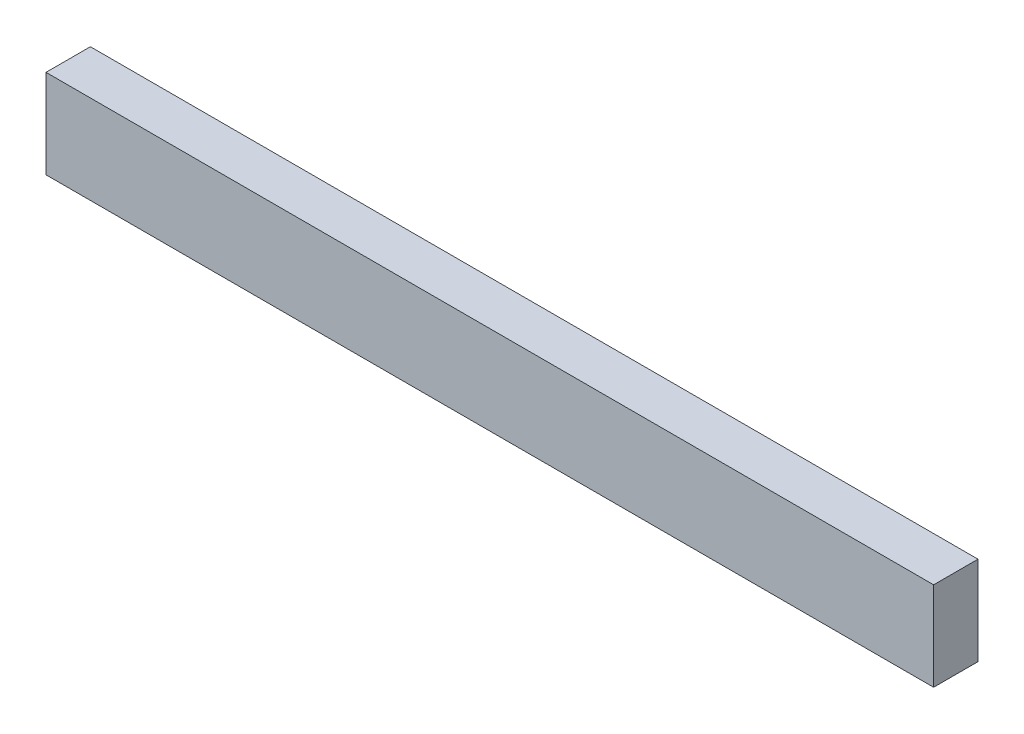
ISO-10303-21;
HEADER;
FILE_DESCRIPTION(('STEP AP214'),'2;1');
FILE_NAME('part.step','',(''),(''),'','','');
FILE_SCHEMA(('AUTOMOTIVE_DESIGN { 1 0 10303 214 1 1 1 1 }'));
ENDSEC;
DATA;
#1=APPLICATION_CONTEXT('core data for automotive mechanical design processes');
#2=APPLICATION_PROTOCOL_DEFINITION('international standard','automotive_design',2000,#1);
#3=PRODUCT_CONTEXT('',#1,'mechanical');
#4=PRODUCT('Part','Part','',(#3));
#5=PRODUCT_RELATED_PRODUCT_CATEGORY('part','',(#4));
#6=PRODUCT_DEFINITION_FORMATION('','',#4);
#7=PRODUCT_DEFINITION_CONTEXT('part definition',#1,'design');
#8=PRODUCT_DEFINITION('design','',#6,#7);
#9=PRODUCT_DEFINITION_SHAPE('','',#8);
#10=(LENGTH_UNIT() NAMED_UNIT(*) SI_UNIT(.MILLI.,.METRE.));
#11=(NAMED_UNIT(*) PLANE_ANGLE_UNIT() SI_UNIT($,.RADIAN.));
#12=(NAMED_UNIT(*) SI_UNIT($,.STERADIAN.) SOLID_ANGLE_UNIT());
#13=UNCERTAINTY_MEASURE_WITH_UNIT(LENGTH_MEASURE(1.E-05),#10,'distance_accuracy_value','');
#14=(GEOMETRIC_REPRESENTATION_CONTEXT(3) GLOBAL_UNCERTAINTY_ASSIGNED_CONTEXT((#13)) GLOBAL_UNIT_ASSIGNED_CONTEXT((#10,
#11,#12)) REPRESENTATION_CONTEXT('',''));
#15=CARTESIAN_POINT('',(0.,0.,0.));
#16=DIRECTION('',(0.,0.,1.));
#17=DIRECTION('',(1.,0.,0.));
#18=AXIS2_PLACEMENT_3D('',#15,#16,#17);
#19=CARTESIAN_POINT('',(10.,-1.,1.));
#20=DIRECTION('',(-1.,0.,0.));
#21=DIRECTION('',(0.,0.,1.));
#22=AXIS2_PLACEMENT_3D('',#19,#20,#21);
#23=PLANE('',#22);
#24=DIRECTION('',(0.,1.,0.));
#25=VECTOR('',#24,1.);
#26=CARTESIAN_POINT('',(10.,-1.,0.));
#27=LINE('',#26,#25);
#28=CARTESIAN_POINT('',(10.,-1.,0.));
#29=VERTEX_POINT('',#28);
#30=CARTESIAN_POINT('',(10.,1.,0.));
#31=VERTEX_POINT('',#30);
#32=EDGE_CURVE('E107',#29,#31,#27,.T.);
#33=ORIENTED_EDGE('',*,*,#32,.T.);
#34=DIRECTION('',(0.,0.,-1.));
#35=VECTOR('',#34,1.);
#36=CARTESIAN_POINT('',(10.,1.,1.));
#37=LINE('',#36,#35);
#38=CARTESIAN_POINT('',(10.,1.,1.));
#39=VERTEX_POINT('',#38);
#40=EDGE_CURVE('E11',#39,#31,#37,.T.);
#41=ORIENTED_EDGE('',*,*,#40,.F.);
#42=DIRECTION('',(0.,1.,0.));
#43=VECTOR('',#42,1.);
#44=CARTESIAN_POINT('',(10.,-1.,1.));
#45=LINE('',#44,#43);
#46=CARTESIAN_POINT('',(10.,-1.,1.));
#47=VERTEX_POINT('',#46);
#48=EDGE_CURVE('E91',#47,#39,#45,.T.);
#49=ORIENTED_EDGE('',*,*,#48,.F.);
#50=DIRECTION('',(0.,0.,-1.));
#51=VECTOR('',#50,1.);
#52=CARTESIAN_POINT('',(10.,-1.,1.));
#53=LINE('',#52,#51);
#54=EDGE_CURVE('E103',#47,#29,#53,.T.);
#55=ORIENTED_EDGE('',*,*,#54,.T.);
#56=EDGE_LOOP('',(#33,#41,#49,#55));
#57=FACE_BOUND('',#56,.T.);
#58=ADVANCED_FACE('F39',(#57),#23,.F.);
#59=CARTESIAN_POINT('',(-10.,1.,1.));
#60=DIRECTION('',(0.,-1.,0.));
#61=DIRECTION('',(0.,0.,-1.));
#62=AXIS2_PLACEMENT_3D('',#59,#60,#61);
#63=PLANE('',#62);
#64=DIRECTION('',(-1.,0.,0.));
#65=VECTOR('',#64,1.);
#66=CARTESIAN_POINT('',(-10.,1.,0.));
#67=LINE('',#66,#65);
#68=CARTESIAN_POINT('',(-10.,1.,0.));
#69=VERTEX_POINT('',#68);
#70=EDGE_CURVE('E96',#31,#69,#67,.T.);
#71=ORIENTED_EDGE('',*,*,#70,.T.);
#72=DIRECTION('',(0.,0.,-1.));
#73=VECTOR('',#72,1.);
#74=CARTESIAN_POINT('',(-10.,1.,1.));
#75=LINE('',#74,#73);
#76=CARTESIAN_POINT('',(-10.,1.,1.));
#77=VERTEX_POINT('',#76);
#78=EDGE_CURVE('E48',#77,#69,#75,.T.);
#79=ORIENTED_EDGE('',*,*,#78,.F.);
#80=DIRECTION('',(-1.,0.,0.));
#81=VECTOR('',#80,1.);
#82=CARTESIAN_POINT('',(-10.,1.,1.));
#83=LINE('',#82,#81);
#84=EDGE_CURVE('E86',#39,#77,#83,.T.);
#85=ORIENTED_EDGE('',*,*,#84,.F.);
#86=ORIENTED_EDGE('',*,*,#40,.T.);
#87=EDGE_LOOP('',(#71,#79,#85,#86));
#88=FACE_BOUND('',#87,.T.);
#89=ADVANCED_FACE('F95',(#88),#63,.F.);
#90=CARTESIAN_POINT('',(-10.,-1.,1.));
#91=DIRECTION('',(1.,0.,0.));
#92=DIRECTION('',(0.,0.,-1.));
#93=AXIS2_PLACEMENT_3D('',#90,#91,#92);
#94=PLANE('',#93);
#95=DIRECTION('',(0.,-1.,0.));
#96=VECTOR('',#95,1.);
#97=CARTESIAN_POINT('',(-10.,-1.,0.));
#98=LINE('',#97,#96);
#99=CARTESIAN_POINT('',(-10.,-1.,0.));
#100=VERTEX_POINT('',#99);
#101=EDGE_CURVE('E73',#69,#100,#98,.T.);
#102=ORIENTED_EDGE('',*,*,#101,.T.);
#103=DIRECTION('',(0.,0.,-1.));
#104=VECTOR('',#103,1.);
#105=CARTESIAN_POINT('',(-10.,-1.,1.));
#106=LINE('',#105,#104);
#107=CARTESIAN_POINT('',(-10.,-1.,1.));
#108=VERTEX_POINT('',#107);
#109=EDGE_CURVE('E98',#108,#100,#106,.T.);
#110=ORIENTED_EDGE('',*,*,#109,.F.);
#111=DIRECTION('',(0.,-1.,0.));
#112=VECTOR('',#111,1.);
#113=CARTESIAN_POINT('',(-10.,-1.,1.));
#114=LINE('',#113,#112);
#115=EDGE_CURVE('E89',#77,#108,#114,.T.);
#116=ORIENTED_EDGE('',*,*,#115,.F.);
#117=ORIENTED_EDGE('',*,*,#78,.T.);
#118=EDGE_LOOP('',(#102,#110,#116,#117));
#119=FACE_BOUND('',#118,.T.);
#120=ADVANCED_FACE('F99',(#119),#94,.F.);
#121=CARTESIAN_POINT('',(-10.,-1.,1.));
#122=DIRECTION('',(0.,1.,0.));
#123=DIRECTION('',(0.,0.,1.));
#124=AXIS2_PLACEMENT_3D('',#121,#122,#123);
#125=PLANE('',#124);
#126=DIRECTION('',(1.,0.,0.));
#127=VECTOR('',#126,1.);
#128=CARTESIAN_POINT('',(-10.,-1.,0.));
#129=LINE('',#128,#127);
#130=EDGE_CURVE('E79',#100,#29,#129,.T.);
#131=ORIENTED_EDGE('',*,*,#130,.T.);
#132=ORIENTED_EDGE('',*,*,#54,.F.);
#133=DIRECTION('',(1.,0.,0.));
#134=VECTOR('',#133,1.);
#135=CARTESIAN_POINT('',(-10.,-1.,1.));
#136=LINE('',#135,#134);
#137=EDGE_CURVE('E56',#108,#47,#136,.T.);
#138=ORIENTED_EDGE('',*,*,#137,.F.);
#139=ORIENTED_EDGE('',*,*,#109,.T.);
#140=EDGE_LOOP('',(#131,#132,#138,#139));
#141=FACE_BOUND('',#140,.T.);
#142=ADVANCED_FACE('F120',(#141),#125,.F.);
#143=CARTESIAN_POINT('',(0.,0.,1.));
#144=DIRECTION('',(0.,0.,-1.));
#145=DIRECTION('',(-1.,0.,0.));
#146=AXIS2_PLACEMENT_3D('',#143,#144,#145);
#147=PLANE('',#146);
#148=ORIENTED_EDGE('',*,*,#48,.T.);
#149=ORIENTED_EDGE('',*,*,#84,.T.);
#150=ORIENTED_EDGE('',*,*,#115,.T.);
#151=ORIENTED_EDGE('',*,*,#137,.T.);
#152=EDGE_LOOP('',(#148,#149,#150,#151));
#153=FACE_BOUND('',#152,.T.);
#154=ADVANCED_FACE('F87',(#153),#147,.F.);
#155=CARTESIAN_POINT('',(0.,0.,0.));
#156=DIRECTION('',(0.,0.,-1.));
#157=DIRECTION('',(-1.,0.,0.));
#158=AXIS2_PLACEMENT_3D('',#155,#156,#157);
#159=PLANE('',#158);
#160=ORIENTED_EDGE('',*,*,#32,.F.);
#161=ORIENTED_EDGE('',*,*,#130,.F.);
#162=ORIENTED_EDGE('',*,*,#101,.F.);
#163=ORIENTED_EDGE('',*,*,#70,.F.);
#164=EDGE_LOOP('',(#160,#161,#162,#163));
#165=FACE_BOUND('',#164,.T.);
#166=ADVANCED_FACE('F123',(#165),#159,.T.);
#167=CLOSED_SHELL('',(#58,#89,#120,#142,#154,#166));
#168=MANIFOLD_SOLID_BREP('B2',#167);
#169=ADVANCED_BREP_SHAPE_REPRESENTATION('',(#18,#168),#14);
#170=SHAPE_DEFINITION_REPRESENTATION(#9,#169);
ENDSEC;
END-ISO-10303-21;
